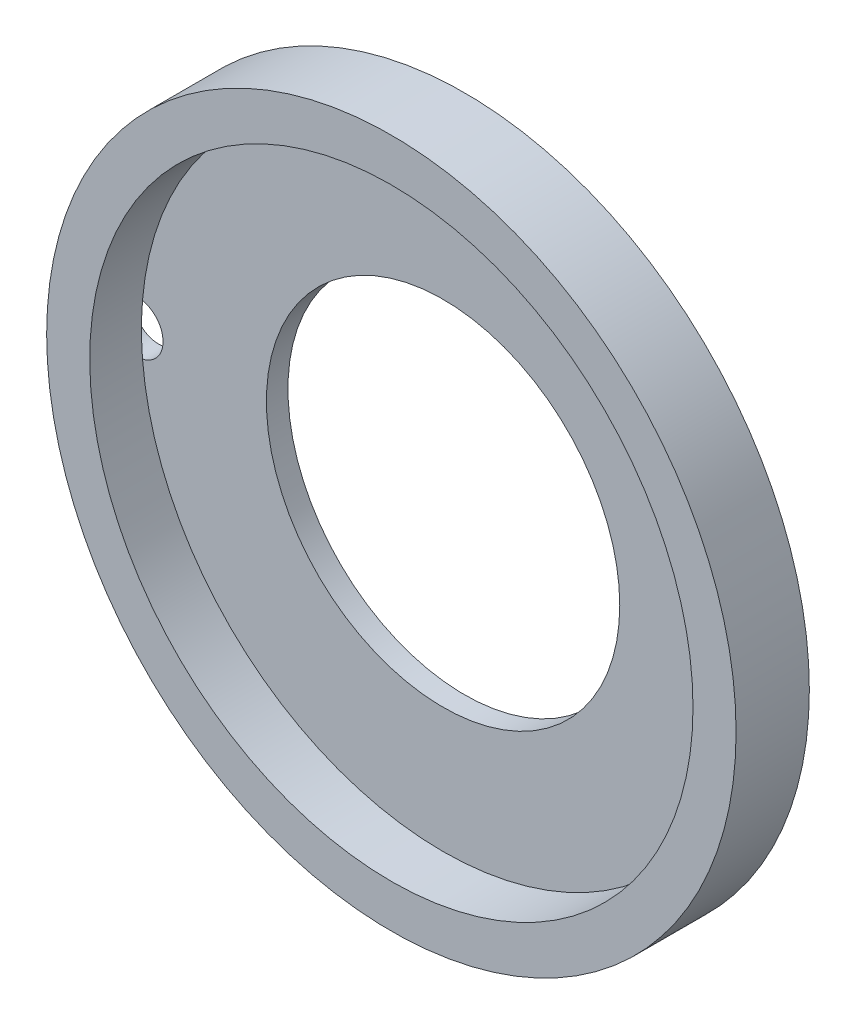
ISO-10303-21;
HEADER;
FILE_DESCRIPTION(('STEP AP214'),'2;1');
FILE_NAME('part.step','',(''),(''),'','','');
FILE_SCHEMA(('AUTOMOTIVE_DESIGN { 1 0 10303 214 1 1 1 1 }'));
ENDSEC;
DATA;
#1=APPLICATION_CONTEXT('core data for automotive mechanical design processes');
#2=APPLICATION_PROTOCOL_DEFINITION('international standard','automotive_design',2000,#1);
#3=PRODUCT_CONTEXT('',#1,'mechanical');
#4=PRODUCT('Part','Part','',(#3));
#5=PRODUCT_RELATED_PRODUCT_CATEGORY('part','',(#4));
#6=PRODUCT_DEFINITION_FORMATION('','',#4);
#7=PRODUCT_DEFINITION_CONTEXT('part definition',#1,'design');
#8=PRODUCT_DEFINITION('design','',#6,#7);
#9=PRODUCT_DEFINITION_SHAPE('','',#8);
#10=(LENGTH_UNIT() NAMED_UNIT(*) SI_UNIT(.MILLI.,.METRE.));
#11=(NAMED_UNIT(*) PLANE_ANGLE_UNIT() SI_UNIT($,.RADIAN.));
#12=(NAMED_UNIT(*) SI_UNIT($,.STERADIAN.) SOLID_ANGLE_UNIT());
#13=UNCERTAINTY_MEASURE_WITH_UNIT(LENGTH_MEASURE(1.E-05),#10,'distance_accuracy_value','');
#14=(GEOMETRIC_REPRESENTATION_CONTEXT(3) GLOBAL_UNCERTAINTY_ASSIGNED_CONTEXT((#13)) GLOBAL_UNIT_ASSIGNED_CONTEXT((#10,
#11,#12)) REPRESENTATION_CONTEXT('',''));
#15=CARTESIAN_POINT('',(0.,0.,0.));
#16=DIRECTION('',(0.,0.,1.));
#17=DIRECTION('',(1.,0.,0.));
#18=AXIS2_PLACEMENT_3D('',#15,#16,#17);
#19=CARTESIAN_POINT('',(0.,0.,-2.5));
#20=DIRECTION('',(0.,0.,1.));
#21=DIRECTION('',(1.,0.,0.));
#22=AXIS2_PLACEMENT_3D('',#19,#20,#21);
#23=PLANE('',#22);
#24=CARTESIAN_POINT('',(0.,0.,-2.5));
#25=DIRECTION('',(0.,0.,1.));
#26=DIRECTION('',(1.,0.,0.));
#27=AXIS2_PLACEMENT_3D('',#24,#25,#26);
#28=CIRCLE('',#27,4.1);
#29=CARTESIAN_POINT('',(4.1,0.,-2.5));
#30=VERTEX_POINT('',#29);
#31=EDGE_CURVE('E49',#30,#30,#28,.T.);
#32=ORIENTED_EDGE('',*,*,#31,.F.);
#33=EDGE_LOOP('',(#32));
#34=FACE_BOUND('',#33,.T.);
#35=CARTESIAN_POINT('',(0.,0.,-2.5));
#36=DIRECTION('',(0.,0.,1.));
#37=DIRECTION('',(1.,0.,0.));
#38=AXIS2_PLACEMENT_3D('',#35,#36,#37);
#39=CIRCLE('',#38,7.);
#40=CARTESIAN_POINT('',(6.97555052706432,0.58710731771052,-2.49992647224679));
#41=VERTEX_POINT('',#40);
#42=CARTESIAN_POINT('',(-6.97553915289986,0.587127160855668,-2.49992820798545));
#43=VERTEX_POINT('',#42);
#44=EDGE_CURVE('E94',#41,#43,#39,.T.);
#45=ORIENTED_EDGE('',*,*,#44,.T.);
#46=CARTESIAN_POINT('',(-6.97525376574585,0.588077281782455,-2.5));
#47=CARTESIAN_POINT('',(-6.96697990629048,0.586423698720654,-2.5));
#48=CARTESIAN_POINT('',(-6.9587416930814,0.584590165604334,-2.5));
#49=CARTESIAN_POINT('',(-6.94240715358778,0.580573892704627,-2.5));
#50=CARTESIAN_POINT('',(-6.93431025518007,0.578393478269612,-2.5));
#51=CARTESIAN_POINT('',(-6.91825824291663,0.573683541245611,-2.5));
#52=CARTESIAN_POINT('',(-6.91030265376792,0.571155640364122,-2.5));
#53=CARTESIAN_POINT('',(-6.89453316671084,0.565751610703839,-2.5));
#54=CARTESIAN_POINT('',(-6.8867189604973,0.562876381790841,-2.5));
#55=CARTESIAN_POINT('',(-6.87123205409678,0.556778384150788,-2.5));
#56=CARTESIAN_POINT('',(-6.86355928210395,0.553555797804259,-2.5));
#57=CARTESIAN_POINT('',(-6.8483549954878,0.546763817032701,-2.5));
#58=CARTESIAN_POINT('',(-6.84082371046806,0.543193908715248,-2.5));
#59=CARTESIAN_POINT('',(-6.82590208432513,0.535707974051064,-2.5));
#60=CARTESIAN_POINT('',(-6.8185123314664,0.531790775544382,-2.5));
#61=CARTESIAN_POINT('',(-6.80387340091427,0.523610910231177,-2.5));
#62=CARTESIAN_POINT('',(-6.79662521705714,0.519346465754322,-2.5));
#63=CARTESIAN_POINT('',(-6.78226901426695,0.510472699847726,-2.5));
#64=CARTESIAN_POINT('',(-6.77516242937389,0.505861059953131,-2.5));
#65=CARTESIAN_POINT('',(-6.7610889735976,0.496293423088125,-2.5));
#66=CARTESIAN_POINT('',(-6.75412399808875,0.49133464021393,-2.5));
#67=CARTESIAN_POINT('',(-6.74033332874348,0.481073170511377,-2.5));
#68=CARTESIAN_POINT('',(-6.73350999957698,0.475767308945436,-2.5));
#69=CARTESIAN_POINT('',(-6.72000204970976,0.46481201660374,-2.5));
#70=CARTESIAN_POINT('',(-6.71332025592354,0.459159101975096,-2.5));
#71=CARTESIAN_POINT('',(-6.70146473826201,0.448716323859663,-2.5));
#72=CARTESIAN_POINT('',(-6.69625043277862,0.443972404094271,-2.5));
#73=CARTESIAN_POINT('',(-6.68590933902217,0.434267387767563,-2.5));
#74=CARTESIAN_POINT('',(-6.68078436558348,0.429304361550329,-2.5));
#75=CARTESIAN_POINT('',(-6.6681471011488,0.416687476849063,-2.5));
#76=CARTESIAN_POINT('',(-6.66073122072199,0.408936291446989,-2.5));
#77=CARTESIAN_POINT('',(-6.64994448135581,0.397097704009619,-2.5));
#78=CARTESIAN_POINT('',(-6.64642712572301,0.393142884861783,-2.5));
#79=CARTESIAN_POINT('',(-6.63951831342334,0.385179817425009,-2.5));
#80=CARTESIAN_POINT('',(-6.63612607642166,0.381172246756721,-2.5));
#81=CARTESIAN_POINT('',(-6.62728947562965,0.370464300979716,-2.5));
#82=CARTESIAN_POINT('',(-6.62193111813585,0.363692582250393,-2.5));
#83=CARTESIAN_POINT('',(-6.61156301924985,0.350001174545457,-2.5));
#84=CARTESIAN_POINT('',(-6.60655015905835,0.34308384675734,-2.5));
#85=CARTESIAN_POINT('',(-6.59687256200322,0.329101509252138,-2.5));
#86=CARTESIAN_POINT('',(-6.59220509791002,0.322038389146193,-2.5));
#87=CARTESIAN_POINT('',(-6.5832179211868,0.307765001973483,-2.5));
#88=CARTESIAN_POINT('',(-6.57889594921282,0.300556158295564,-2.5));
#89=CARTESIAN_POINT('',(-6.57059925444704,0.285991783011548,-2.5));
#90=CARTESIAN_POINT('',(-6.56662281368143,0.278637230576297,-2.5));
#91=CARTESIAN_POINT('',(-6.5590166220593,0.263781888224626,-2.5));
#92=CARTESIAN_POINT('',(-6.55538575877183,0.256281668081852,-2.5));
#93=CARTESIAN_POINT('',(-6.54847009807038,0.241135397058149,-2.5));
#94=CARTESIAN_POINT('',(-6.54518484597083,0.233489553813549,-2.5));
#95=CARTESIAN_POINT('',(-6.53895973664767,0.218052393178284,-2.5));
#96=CARTESIAN_POINT('',(-6.53602011985273,0.210260978841649,-2.5));
#97=CARTESIAN_POINT('',(-6.53048557770596,0.194532971117786,-2.5));
#98=CARTESIAN_POINT('',(-6.52789160852972,0.18659604138126,-2.5));
#99=CARTESIAN_POINT('',(-6.52304764297845,0.170577229830558,-2.5));
#100=CARTESIAN_POINT('',(-6.52079932149375,0.162494841893252,-2.5));
#101=CARTESIAN_POINT('',(-6.51664593677974,0.146185269585434,-2.5));
#102=CARTESIAN_POINT('',(-6.5147432526184,0.137957480045045,-2.5));
#103=CARTESIAN_POINT('',(-6.51128044374281,0.121357187037543,-2.5));
#104=CARTESIAN_POINT('',(-6.50972337136237,0.112984047920259,-2.5));
#105=CARTESIAN_POINT('',(-6.50695402464407,0.0961106479654506,-2.5));
#106=CARTESIAN_POINT('',(-6.50574467927245,0.0876099076555871,-2.5));
#107=CARTESIAN_POINT('',(-6.50366584674941,0.0704642776854486,-2.5));
#108=CARTESIAN_POINT('',(-6.50280058371131,0.0618188777905461,-2.5));
#109=CARTESIAN_POINT('',(-6.50140956081519,0.0443838096479167,-2.5));
#110=CARTESIAN_POINT('',(-6.50088852980371,0.0355937664280112,-2.5));
#111=CARTESIAN_POINT('',(-6.50018477101704,0.0178693367006783,-2.5));
#112=CARTESIAN_POINT('',(-6.50000719390881,0.00893474905512071,-2.5));
#113=CARTESIAN_POINT('',(-6.49999280588945,-0.00893499961107578,-2.5));
#114=CARTESIAN_POINT('',(-6.50015600453452,-0.0178701606407676,-2.5));
#115=CARTESIAN_POINT('',(-6.50083671255215,-0.0355986876388286,-2.5));
#116=CARTESIAN_POINT('',(-6.50134909868004,-0.0443922467277292,-2.5));
#117=CARTESIAN_POINT('',(-6.50272703371341,-0.061837311356122,-2.5));
#118=CARTESIAN_POINT('',(-6.50358792685108,-0.0704891826326886,-2.5));
#119=CARTESIAN_POINT('',(-6.50566258452377,-0.0876507205251129,-2.5));
#120=CARTESIAN_POINT('',(-6.50687221870573,-0.096160884505827,-2.5));
#121=CARTESIAN_POINT('',(-6.5096409303574,-0.113021694659241,-2.5));
#122=CARTESIAN_POINT('',(-6.5111957373013,-0.121373040492432,-2.5));
#123=CARTESIAN_POINT('',(-6.51465556209771,-0.137933911182517,-2.5));
#124=CARTESIAN_POINT('',(-6.51655770599623,-0.146144035481344,-2.5));
#125=CARTESIAN_POINT('',(-6.52071153674422,-0.162422448602463,-2.5));
#126=CARTESIAN_POINT('',(-6.52296103375498,-0.170491295641594,-2.5));
#127=CARTESIAN_POINT('',(-6.52780886911464,-0.186487208399263,-2.5));
#128=CARTESIAN_POINT('',(-6.53040572898317,-0.194414721921646,-2.5));
#129=CARTESIAN_POINT('',(-6.5359475648934,-0.210128091428767,-2.5));
#130=CARTESIAN_POINT('',(-6.53889178434853,-0.217914214173441,-2.5));
#131=CARTESIAN_POINT('',(-6.54512760983372,-0.23334499702208,-2.5));
#132=CARTESIAN_POINT('',(-6.54841917401202,-0.240989674038765,-2.5));
#133=CARTESIAN_POINT('',(-6.55534897225863,-0.256137828131516,-2.5));
#134=CARTESIAN_POINT('',(-6.55898785447835,-0.26364100863677,-2.5));
#135=CARTESIAN_POINT('',(-6.56661160412305,-0.278506495564392,-2.5));
#136=CARTESIAN_POINT('',(-6.57059776858321,-0.285868136544796,-2.5));
#137=CARTESIAN_POINT('',(-6.57891544096119,-0.300450919126621,-2.5));
#138=CARTESIAN_POINT('',(-6.58324883941027,-0.307670981793034,-2.5));
#139=CARTESIAN_POINT('',(-6.59226041364947,-0.321971039449853,-2.5));
#140=CARTESIAN_POINT('',(-6.59694100686203,-0.329049510107056,-2.5));
#141=CARTESIAN_POINT('',(-6.6066464183738,-0.343066785479498,-2.5));
#142=CARTESIAN_POINT('',(-6.61167410580519,-0.350003601450974,-2.5));
#143=CARTESIAN_POINT('',(-6.62207344701293,-0.363738205159187,-2.5));
#144=CARTESIAN_POINT('',(-6.62744834481601,-0.370533537151725,-2.5));
#145=CARTESIAN_POINT('',(-6.63628884564292,-0.38125380601153,-2.5));
#146=CARTESIAN_POINT('',(-6.63966812494388,-0.385250300540975,-2.5));
#147=CARTESIAN_POINT('',(-6.64655000692628,-0.393193340714595,-2.5));
#148=CARTESIAN_POINT('',(-6.65005339556246,-0.397139204770393,-2.5));
#149=CARTESIAN_POINT('',(-6.66079675533325,-0.408955508173855,-2.5));
#150=CARTESIAN_POINT('',(-6.66818036836743,-0.416696236722928,-2.5));
#151=CARTESIAN_POINT('',(-6.68080725792648,-0.429343630402293,-2.5));
#152=CARTESIAN_POINT('',(-6.68595605061419,-0.434345299552442,-2.5));
#153=CARTESIAN_POINT('',(-6.6963499566765,-0.444123489959172,-2.5));
#154=CARTESIAN_POINT('',(-6.70159322645265,-0.44890196664328,-2.5));
#155=CARTESIAN_POINT('',(-6.71345207899294,-0.45935987176221,-2.5));
#156=CARTESIAN_POINT('',(-6.72010688585597,-0.464994938393768,-2.5));
#157=CARTESIAN_POINT('',(-6.73356497257245,-0.475916288227512,-2.5));
#158=CARTESIAN_POINT('',(-6.74036551367174,-0.481205944539995,-2.5));
#159=CARTESIAN_POINT('',(-6.75411463132824,-0.491436848928233,-2.5));
#160=CARTESIAN_POINT('',(-6.76106093902598,-0.496381143163864,-2.5));
#161=CARTESIAN_POINT('',(-6.77510109783111,-0.505921645178492,-2.5));
#162=CARTESIAN_POINT('',(-6.78219315325781,-0.510520493656939,-2.5));
#163=CARTESIAN_POINT('',(-6.79652432699218,-0.519370540937119,-2.5));
#164=CARTESIAN_POINT('',(-6.80376211221575,-0.523623897094491,-2.5));
#165=CARTESIAN_POINT('',(-6.81838427643744,-0.531783463941841,-2.5));
#166=CARTESIAN_POINT('',(-6.82576776077442,-0.535691277131879,-2.5));
#167=CARTESIAN_POINT('',(-6.8406808831274,-0.543160332992319,-2.5));
#168=CARTESIAN_POINT('',(-6.84821002740799,-0.546722561184334,-2.5));
#169=CARTESIAN_POINT('',(-6.86341407161552,-0.553501083782543,-2.5));
#170=CARTESIAN_POINT('',(-6.87108882926005,-0.55671769728854,-2.5));
#171=CARTESIAN_POINT('',(-6.88658375379996,-0.562805658448182,-2.5));
#172=CARTESIAN_POINT('',(-6.89440407056043,-0.56567662460574,-2.5));
#173=CARTESIAN_POINT('',(-6.91018983693852,-0.571074040039368,-2.5));
#174=CARTESIAN_POINT('',(-6.9181556622598,-0.573599390177141,-2.5));
#175=CARTESIAN_POINT('',(-6.93423221152132,-0.578306138510899,-2.5));
#176=CARTESIAN_POINT('',(-6.94234346677413,-0.580485719648844,-2.5));
#177=CARTESIAN_POINT('',(-6.95871081487132,-0.584502223100507,-2.5));
#178=CARTESIAN_POINT('',(-6.96696752471849,-0.586336632914743,-2.5));
#179=CARTESIAN_POINT('',(-6.9752596977618,-0.587991624914976,-2.5));
#180=B_SPLINE_CURVE_WITH_KNOTS('',3,(#46,#47,#48,#49,#50,#51,#52,#53,#54,#55,#56,#57,#58,#59,
#60,#61,#62,#63,#64,#65,#66,#67,#68,#69,#70,#71,#72,#73,#74,#75,#76,#77,#78,#79,#80,#81,#82,#83,
#84,#85,#86,#87,#88,#89,#90,#91,#92,#93,#94,#95,#96,#97,#98,#99,#100,#101,#102,#103,#104,#105,
#106,#107,#108,#109,#110,#111,#112,#113,#114,#115,#116,#117,#118,#119,#120,#121,#122,#123,#124,
#125,#126,#127,#128,#129,#130,#131,#132,#133,#134,#135,#136,#137,#138,#139,#140,#141,#142,#143,
#144,#145,#146,#147,#148,#149,#150,#151,#152,#153,#154,#155,#156,#157,#158,#159,#160,#161,#162,
#163,#164,#165,#166,#167,#168,#169,#170,#171,#172,#173,#174,#175,#176,#177,#178,#179),
.UNSPECIFIED.,.F.,.F.,(4,2,2,2,2,2,2,2,2,2,2,2,2,2,2,2,2,2,2,2,2,2,2,2,2,2,2,2,2,2,2,2,2,2,2,2,
2,2,2,2,2,2,2,2,2,2,2,2,2,2,2,2,2,2,2,2,2,2,2,2,2,2,2,2,2,2,4),(0.,0.0253109121493602,
0.0504587939035583,0.0754930623329075,0.100463809038629,0.125421508100619,0.150416712642199,
0.175499749018622,0.200720417800903,0.226127710257383,0.251769547989723,0.277692551881889,
0.303941844738532,0.325086514897414,0.346486287859628,0.378654527065373,0.394531222917508,
0.410281302899537,0.436179143899964,0.46179964710699,0.487189549762534,0.512396871820099,
0.537470682259454,0.562460836535936,0.587417691461091,0.612391805277741,0.637433631694315,
0.662593217060684,0.687919909650053,0.713462089185171,0.739213502482546,0.765271954471622,
0.79168132364166,0.818483765069434,0.845286958114437,0.871705131168323,0.897781449768808,
0.923560796737931,0.949037402706664,0.974312046635058,0.999433407185536,1.02445105780038,
1.04941518976695,1.07437631721707,1.09938497248874,1.12449140094028,1.14974526434505,
1.17519536140419,1.20088937276777,1.22687363638563,1.2425732864604,1.25840211954234,
1.29048122613164,1.3120128617611,1.33329140406249,1.35944424688467,1.385283358613,
1.41085430224669,1.4362040868198,1.46138096020925,1.48643416929736,1.511413692386,
1.53636995047968,1.56135350544129,1.58641475391737,1.6116036262228,1.63696929903149),.UNSPECIFIED.);
#181=CARTESIAN_POINT('',(-6.9755636245741,-0.587105452720418,-2.49992560583814));
#182=VERTEX_POINT('',#181);
#183=EDGE_CURVE('E92',#43,#182,#180,.T.);
#184=ORIENTED_EDGE('',*,*,#183,.T.);
#185=CARTESIAN_POINT('',(6.97555195205322,-0.58712496469415,-2.49992735280683));
#186=VERTEX_POINT('',#185);
#187=EDGE_CURVE('E91',#182,#186,#39,.T.);
#188=ORIENTED_EDGE('',*,*,#187,.T.);
#189=CARTESIAN_POINT('',(6.9752537666858,-0.58807728197037,-2.5));
#190=CARTESIAN_POINT('',(6.96697990722233,-0.58642369892106,-2.5));
#191=CARTESIAN_POINT('',(6.95874169400488,-0.58459016581709,-2.5));
#192=CARTESIAN_POINT('',(6.94240715449464,-0.580573892941798,-2.5));
#193=CARTESIAN_POINT('',(6.93431025607866,-0.578393478518874,-2.5));
#194=CARTESIAN_POINT('',(6.91825824379877,-0.573683541518806,-2.5));
#195=CARTESIAN_POINT('',(6.91030265464187,-0.571155640649188,-2.5));
#196=CARTESIAN_POINT('',(6.89453316756866,-0.565751611012212,-2.5));
#197=CARTESIAN_POINT('',(6.88671896134717,-0.562876382110679,-2.5));
#198=CARTESIAN_POINT('',(6.87123205493034,-0.556778384493816,-2.5));
#199=CARTESIAN_POINT('',(6.86355928292912,-0.553555798159037,-2.5));
#200=CARTESIAN_POINT('',(6.84835499629834,-0.546763817408662,-2.5));
#201=CARTESIAN_POINT('',(6.84082371127232,-0.543193909100661,-2.5));
#202=CARTESIAN_POINT('',(6.82590208510948,-0.535707974462718,-2.5));
#203=CARTESIAN_POINT('',(6.81851233223707,-0.531790775972872,-2.5));
#204=CARTESIAN_POINT('',(6.80387340168579,-0.523610910664463,-2.5));
#205=CARTESIAN_POINT('',(6.79662521784332,-0.519346466175428,-2.5));
#206=CARTESIAN_POINT('',(6.78226901497686,-0.510472700351879,-2.5));
#207=CARTESIAN_POINT('',(6.77516242999206,-0.505861060553323,-2.5));
#208=CARTESIAN_POINT('',(6.7610889744316,-0.496293423473533,-2.5));
#209=CARTESIAN_POINT('',(6.75412399923399,-0.491334640284765,-2.5));
#210=CARTESIAN_POINT('',(6.740333329,-0.481073171492169,-2.5));
#211=CARTESIAN_POINT('',(6.73350999861688,-0.475767311167685,-2.5));
#212=CARTESIAN_POINT('',(6.72000205205319,-0.464812015465666,-2.5));
#213=CARTESIAN_POINT('',(6.71332026285948,-0.459159096161507,-2.5));
#214=CARTESIAN_POINT('',(6.7014647337567,-0.448716329495616,-2.5));
#215=CARTESIAN_POINT('',(6.6962504160589,-0.443972421964896,-2.5));
#216=CARTESIAN_POINT('',(6.68590935659465,-0.434267370292358,-2.5));
#217=CARTESIAN_POINT('',(6.68078443037284,-0.429304295771168,-2.5));
#218=CARTESIAN_POINT('',(6.66813811898387,-0.416678705513152,-2.5));
#219=CARTESIAN_POINT('',(6.66071340790758,-0.408918598112365,-2.5));
#220=CARTESIAN_POINT('',(6.64991384783868,-0.397067119696294,-2.5));
#221=CARTESIAN_POINT('',(6.64639250537537,-0.393108340695573,-2.5));
#222=CARTESIAN_POINT('',(6.63947604634277,-0.385137649605567,-2.5));
#223=CARTESIAN_POINT('',(6.63608014177133,-0.381126421903321,-2.5));
#224=CARTESIAN_POINT('',(6.62723445903703,-0.370409455927015,-2.5));
#225=CARTESIAN_POINT('',(6.62187068232193,-0.363632364674144,-2.5));
#226=CARTESIAN_POINT('',(6.61149264228157,-0.349931035201485,-2.5));
#227=CARTESIAN_POINT('',(6.60647521975217,-0.343009189350331,-2.5));
#228=CARTESIAN_POINT('',(6.59678939729563,-0.329018640694985,-2.5));
#229=CARTESIAN_POINT('',(6.59211822677497,-0.321951858072026,-2.5));
#230=CARTESIAN_POINT('',(6.58312453962799,-0.30767197126932,-2.5));
#231=CARTESIAN_POINT('',(6.57879971789689,-0.30046031971722,-2.5));
#232=CARTESIAN_POINT('',(6.57049822811152,-0.285891155784646,-2.5));
#233=CARTESIAN_POINT('',(6.56651979472473,-0.278534649831702,-2.5));
#234=CARTESIAN_POINT('',(6.55891052368076,-0.263676229748867,-2.5));
#235=CARTESIAN_POINT('',(6.55527852557333,-0.25617491011365,-2.5));
#236=CARTESIAN_POINT('',(6.54836150135936,-0.24102727218821,-2.5));
#237=CARTESIAN_POINT('',(6.54507597293182,-0.233381183315486,-2.5));
#238=CARTESIAN_POINT('',(6.53885121633435,-0.217944366645291,-2.5));
#239=CARTESIAN_POINT('',(6.53591218242765,-0.210153560518188,-2.5));
#240=CARTESIAN_POINT('',(6.53037970954723,-0.194427607753604,-2.5));
#241=CARTESIAN_POINT('',(6.52778718311392,-0.186492140189023,-2.5));
#242=CARTESIAN_POINT('',(6.52294700379321,-0.170477094811294,-2.5));
#243=CARTESIAN_POINT('',(6.5207009856588,-0.162397023266046,-2.5));
#244=CARTESIAN_POINT('',(6.51655310400578,-0.146092928649371,-2.5));
#245=CARTESIAN_POINT('',(6.51465358372561,-0.137868310101951,-2.5));
#246=CARTESIAN_POINT('',(6.5111979965183,-0.121275206640935,-2.5));
#247=CARTESIAN_POINT('',(6.50964495104156,-0.112906093542708,-2.5));
#248=CARTESIAN_POINT('',(6.50688452934292,-0.0960415846139106,-2.5));
#249=CARTESIAN_POINT('',(6.50568005511964,-0.0875457149952916,-2.5));
#250=CARTESIAN_POINT('',(6.50361186686187,-0.0704106739971589,-2.5));
#251=CARTESIAN_POINT('',(6.50275235725887,-0.0617709970771812,-2.5));
#252=CARTESIAN_POINT('',(6.50137362268307,-0.0443482246021878,-2.5));
#253=CARTESIAN_POINT('',(6.5008591107541,-0.0355647583102075,-2.5));
#254=CARTESIAN_POINT('',(6.50016960432915,-0.0178543280667493,-2.5));
#255=CARTESIAN_POINT('',(6.49999975629653,-0.0089271672105942,-2.5));
#256=CARTESIAN_POINT('',(6.50000024412492,0.008942605560086,-2.5));
#257=CARTESIAN_POINT('',(6.50017116879675,0.0178852174966084,-2.5));
#258=CARTESIAN_POINT('',(6.50086612054851,0.0356277847776313,-2.5));
#259=CARTESIAN_POINT('',(6.50138501954132,0.0444279374752159,-2.5));
#260=CARTESIAN_POINT('',(6.50277522749682,0.0618853250020768,-2.5));
#261=CARTESIAN_POINT('',(6.50364186430785,0.0705429298029494,-2.5));
#262=CARTESIAN_POINT('',(6.50572714395241,0.0877150712587582,-2.5));
#263=CARTESIAN_POINT('',(6.50694163601075,0.096230110014929,-2.5));
#264=CARTESIAN_POINT('',(6.50971922587653,0.113099798058831,-2.5));
#265=CARTESIAN_POINT('',(6.51127802835951,0.121455152936426,-2.5));
#266=CARTESIAN_POINT('',(6.51474501620827,0.138023179805068,-2.5));
#267=CARTESIAN_POINT('',(6.51665029627778,0.146236458761585,-2.5));
#268=CARTESIAN_POINT('',(6.52080957872186,0.162520317472573,-2.5));
#269=CARTESIAN_POINT('',(6.52306135503294,0.170591465223114,-2.5));
#270=CARTESIAN_POINT('',(6.52791293250478,0.186591113324736,-2.5));
#271=CARTESIAN_POINT('',(6.53051121473891,0.194520073970363,-2.5));
#272=CARTESIAN_POINT('',(6.53605508305687,0.210235468883103,-2.5));
#273=CARTESIAN_POINT('',(6.53899986871587,0.218022185429247,-2.5));
#274=CARTESIAN_POINT('',(6.54523601729569,0.233453283897738,-2.5));
#275=CARTESIAN_POINT('',(6.54852729211336,0.241097701424013,-2.5));
#276=CARTESIAN_POINT('',(6.55545570456418,0.256244461683478,-2.5));
#277=CARTESIAN_POINT('',(6.5590934427471,0.263746529661032,-2.5));
#278=CARTESIAN_POINT('',(6.5667140975742,0.27860891251997,-2.5));
#279=CARTESIAN_POINT('',(6.57069826337864,0.285968586652956,-2.5));
#280=CARTESIAN_POINT('',(6.57901113393438,0.300546557869891,-2.5));
#281=CARTESIAN_POINT('',(6.58334168211293,0.307763803200642,-2.5));
#282=CARTESIAN_POINT('',(6.5923467412709,0.32205733070077,-2.5));
#283=CARTESIAN_POINT('',(6.59702362417966,0.329132117513143,-2.5));
#284=CARTESIAN_POINT('',(6.60672083207539,0.343141186505468,-2.5));
#285=CARTESIAN_POINT('',(6.61174398345341,0.350073510710504,-2.5));
#286=CARTESIAN_POINT('',(6.62213333975889,0.363798069593847,-2.5));
#287=CARTESIAN_POINT('',(6.62750274759455,0.370587877428966,-2.5));
#288=CARTESIAN_POINT('',(6.63858409941192,0.384028044081207,-2.5));
#289=CARTESIAN_POINT('',(6.64429954055653,0.390675517061052,-2.5));
#290=CARTESIAN_POINT('',(6.65607331779345,0.403830794840097,-2.5));
#291=CARTESIAN_POINT('',(6.66213537829681,0.410335261800284,-2.5));
#292=CARTESIAN_POINT('',(6.67455177767361,0.423157930785266,-2.5));
#293=CARTESIAN_POINT('',(6.68090803310329,0.429474276048558,-2.5));
#294=CARTESIAN_POINT('',(6.69377638150263,0.441767694821891,-2.5));
#295=CARTESIAN_POINT('',(6.70028517827729,0.447748214743037,-2.5));
#296=CARTESIAN_POINT('',(6.71345202195694,0.459360048561346,-2.5));
#297=CARTESIAN_POINT('',(6.72010687039799,0.464994985263816,-2.5));
#298=CARTESIAN_POINT('',(6.73356498712271,0.47591624133359,-2.5));
#299=CARTESIAN_POINT('',(6.74036551728377,0.481205931837418,-2.5));
#300=CARTESIAN_POINT('',(6.75411462703046,0.491436860960819,-2.5));
#301=CARTESIAN_POINT('',(6.76106093761284,0.496381146189585,-2.5));
#302=CARTESIAN_POINT('',(6.77510109850846,0.505921641687269,-2.5));
#303=CARTESIAN_POINT('',(6.78219315317261,0.510520492556886,-2.5));
#304=CARTESIAN_POINT('',(6.7965243263535,0.519370541583009,-2.5));
#305=CARTESIAN_POINT('',(6.80376211177956,0.523623897115764,-2.5));
#306=CARTESIAN_POINT('',(6.81838427614908,0.531783463517557,-2.5));
#307=CARTESIAN_POINT('',(6.82576776043266,0.535691276882732,-2.5));
#308=CARTESIAN_POINT('',(6.84068088274727,0.543160332879696,-2.5));
#309=CARTESIAN_POINT('',(6.84821002704268,0.546722561033736,-2.5));
#310=CARTESIAN_POINT('',(6.86341407126178,0.55350108361258,-2.5));
#311=CARTESIAN_POINT('',(6.87108882890307,0.556717697137146,-2.5));
#312=CARTESIAN_POINT('',(6.88658375344146,0.562805658318476,-2.5));
#313=CARTESIAN_POINT('',(6.89440407020365,0.565676624479146,-2.5));
#314=CARTESIAN_POINT('',(6.91018983658401,0.571074039922781,-2.5));
#315=CARTESIAN_POINT('',(6.91815566190583,0.57359939006747,-2.5));
#316=CARTESIAN_POINT('',(6.93423221116886,0.578306138413779,-2.5));
#317=CARTESIAN_POINT('',(6.94234346642264,0.580485719557363,-2.5));
#318=CARTESIAN_POINT('',(6.95871081452189,0.584502223020036,-2.5));
#319=CARTESIAN_POINT('',(6.96696752437014,0.58633663283965,-2.5));
#320=CARTESIAN_POINT('',(6.97525969741451,0.587991624845642,-2.5));
#321=B_SPLINE_CURVE_WITH_KNOTS('',3,(#189,#190,#191,#192,#193,#194,#195,#196,#197,#198,#199,
#200,#201,#202,#203,#204,#205,#206,#207,#208,#209,#210,#211,#212,#213,#214,#215,#216,#217,#218,
#219,#220,#221,#222,#223,#224,#225,#226,#227,#228,#229,#230,#231,#232,#233,#234,#235,#236,#237,
#238,#239,#240,#241,#242,#243,#244,#245,#246,#247,#248,#249,#250,#251,#252,#253,#254,#255,#256,
#257,#258,#259,#260,#261,#262,#263,#264,#265,#266,#267,#268,#269,#270,#271,#272,#273,#274,#275,
#276,#277,#278,#279,#280,#281,#282,#283,#284,#285,#286,#287,#288,#289,#290,#291,#292,#293,#294,
#295,#296,#297,#298,#299,#300,#301,#302,#303,#304,#305,#306,#307,#308,#309,#310,#311,#312,#313,
#314,#315,#316,#317,#318,#319,#320),.UNSPECIFIED.,.F.,.F.,(4,2,2,2,2,2,2,2,2,2,2,2,2,2,2,2,2,2,
2,2,2,2,2,2,2,2,2,2,2,2,2,2,2,2,2,2,2,2,2,2,2,2,2,2,2,2,2,2,2,2,2,2,2,2,2,2,2,2,2,2,2,2,2,2,2,
4),(0.,0.0253109121658184,0.0504587939345242,0.075493062376453,0.100463809092865,
0.125421508163703,0.150416712712346,0.17549974909412,0.200720417880118,0.226127710338768,
0.251769548071826,0.277692551963358,0.303941844818119,0.325086515411298,0.346486288818038,
0.378692189812931,0.394585712986456,0.410351276041263,0.436271846683015,0.461911354667856,
0.487316549395413,0.512535483368024,0.537617279643698,0.562611869863254,0.587569709076659,
0.612541475099318,0.637577761175898,0.662728771192511,0.688044026500977,0.713572092623179,
0.739306948633207,0.765346573696715,0.791735050627799,0.818514739530768,0.845340740347339,
0.871779849620901,0.897875024445217,0.923670940199602,0.949161597871441,0.974447617390619,
0.999577492088575,1.02460062311119,1.04956704525462,1.07452713435187,1.09953130451347,
1.12462970421996,1.14987192034322,1.17530669862864,1.20098168806726,1.22694321505523,
1.25323609144885,1.27990345875765,1.30677958761918,1.3332901069941,1.35944294983211,
1.38528206157526,1.41085300522272,1.43620278980864,1.46137966320994,1.48643287230899,
1.5114123954077,1.53636865351064,1.56135220848074,1.58641345696463,1.61160232927723,
1.63696800209253),.UNSPECIFIED.);
#322=EDGE_CURVE('E69',#186,#41,#321,.T.);
#323=ORIENTED_EDGE('',*,*,#322,.T.);
#324=EDGE_LOOP('',(#45,#184,#188,#323));
#325=FACE_BOUND('',#324,.T.);
#326=ADVANCED_FACE('F39',(#34,#325),#23,.T.);
#327=CARTESIAN_POINT('',(0.,0.,-3.));
#328=DIRECTION('',(0.,0.,1.));
#329=DIRECTION('',(1.,0.,0.));
#330=AXIS2_PLACEMENT_3D('',#327,#328,#329);
#331=PLANE('',#330);
#332=CARTESIAN_POINT('',(-7.1,0.,-3.));
#333=DIRECTION('',(0.,0.,-1.));
#334=DIRECTION('',(-1.,0.,0.));
#335=AXIS2_PLACEMENT_3D('',#332,#333,#334);
#336=CIRCLE('',#335,0.6);
#337=CARTESIAN_POINT('',(-7.7,0.,-3.));
#338=VERTEX_POINT('',#337);
#339=EDGE_CURVE('E153',#338,#338,#336,.T.);
#340=ORIENTED_EDGE('',*,*,#339,.F.);
#341=EDGE_LOOP('',(#340));
#342=FACE_BOUND('',#341,.T.);
#343=CARTESIAN_POINT('',(7.1,0.,-3.));
#344=DIRECTION('',(0.,0.,-1.));
#345=DIRECTION('',(-1.,0.,0.));
#346=AXIS2_PLACEMENT_3D('',#343,#344,#345);
#347=CIRCLE('',#346,0.6);
#348=CARTESIAN_POINT('',(6.5,0.,-3.));
#349=VERTEX_POINT('',#348);
#350=EDGE_CURVE('E88',#349,#349,#347,.T.);
#351=ORIENTED_EDGE('',*,*,#350,.F.);
#352=EDGE_LOOP('',(#351));
#353=FACE_BOUND('',#352,.T.);
#354=CARTESIAN_POINT('',(0.,0.,-3.));
#355=DIRECTION('',(0.,0.,1.));
#356=DIRECTION('',(1.,0.,0.));
#357=AXIS2_PLACEMENT_3D('',#354,#355,#356);
#358=CIRCLE('',#357,8.);
#359=CARTESIAN_POINT('',(8.,0.,-3.));
#360=VERTEX_POINT('',#359);
#361=EDGE_CURVE('E11',#360,#360,#358,.T.);
#362=ORIENTED_EDGE('',*,*,#361,.F.);
#363=EDGE_LOOP('',(#362));
#364=FACE_BOUND('',#363,.T.);
#365=CARTESIAN_POINT('',(0.,0.,-3.));
#366=DIRECTION('',(0.,0.,1.));
#367=DIRECTION('',(1.,0.,0.));
#368=AXIS2_PLACEMENT_3D('',#365,#366,#367);
#369=CIRCLE('',#368,4.1);
#370=CARTESIAN_POINT('',(4.1,0.,-3.));
#371=VERTEX_POINT('',#370);
#372=EDGE_CURVE('E161',#371,#371,#369,.T.);
#373=ORIENTED_EDGE('',*,*,#372,.T.);
#374=EDGE_LOOP('',(#373));
#375=FACE_BOUND('',#374,.T.);
#376=ADVANCED_FACE('F139',(#342,#353,#364,#375),#331,.F.);
#377=CARTESIAN_POINT('',(0.,0.,-2.5));
#378=DIRECTION('',(0.,0.,-1.));
#379=DIRECTION('',(-1.,0.,0.));
#380=AXIS2_PLACEMENT_3D('',#377,#378,#379);
#381=CYLINDRICAL_SURFACE('',#380,8.);
#382=ORIENTED_EDGE('',*,*,#361,.T.);
#383=EDGE_LOOP('',(#382));
#384=FACE_BOUND('',#383,.T.);
#385=CARTESIAN_POINT('',(0.,0.,-1.3));
#386=DIRECTION('',(0.,0.,1.));
#387=DIRECTION('',(1.,0.,0.));
#388=AXIS2_PLACEMENT_3D('',#385,#386,#387);
#389=CIRCLE('',#388,8.);
#390=CARTESIAN_POINT('',(8.,0.,-1.3));
#391=VERTEX_POINT('',#390);
#392=EDGE_CURVE('E162',#391,#391,#389,.T.);
#393=ORIENTED_EDGE('',*,*,#392,.F.);
#394=EDGE_LOOP('',(#393));
#395=FACE_BOUND('',#394,.T.);
#396=ADVANCED_FACE('F41',(#384,#395),#381,.T.);
#397=CARTESIAN_POINT('',(0.,0.,-2.5));
#398=DIRECTION('',(0.,0.,-1.));
#399=DIRECTION('',(-1.,0.,0.));
#400=AXIS2_PLACEMENT_3D('',#397,#398,#399);
#401=CYLINDRICAL_SURFACE('',#400,4.1);
#402=ORIENTED_EDGE('',*,*,#31,.T.);
#403=EDGE_LOOP('',(#402));
#404=FACE_BOUND('',#403,.T.);
#405=ORIENTED_EDGE('',*,*,#372,.F.);
#406=EDGE_LOOP('',(#405));
#407=FACE_BOUND('',#406,.T.);
#408=ADVANCED_FACE('F142',(#404,#407),#401,.F.);
#409=CARTESIAN_POINT('',(0.,0.,-1.3));
#410=DIRECTION('',(0.,0.,1.));
#411=DIRECTION('',(1.,0.,0.));
#412=AXIS2_PLACEMENT_3D('',#409,#410,#411);
#413=PLANE('',#412);
#414=ORIENTED_EDGE('',*,*,#392,.T.);
#415=EDGE_LOOP('',(#414));
#416=FACE_BOUND('',#415,.T.);
#417=CARTESIAN_POINT('',(0.,0.,-1.3));
#418=DIRECTION('',(0.,0.,1.));
#419=DIRECTION('',(1.,0.,0.));
#420=AXIS2_PLACEMENT_3D('',#417,#418,#419);
#421=CIRCLE('',#420,7.);
#422=CARTESIAN_POINT('',(7.,0.,-1.3));
#423=VERTEX_POINT('',#422);
#424=EDGE_CURVE('E169',#423,#423,#421,.T.);
#425=ORIENTED_EDGE('',*,*,#424,.F.);
#426=EDGE_LOOP('',(#425));
#427=FACE_BOUND('',#426,.T.);
#428=ADVANCED_FACE('F119',(#416,#427),#413,.T.);
#429=CARTESIAN_POINT('',(0.,0.,-1.3));
#430=DIRECTION('',(0.,0.,-1.));
#431=DIRECTION('',(-1.,0.,0.));
#432=AXIS2_PLACEMENT_3D('',#429,#430,#431);
#433=CYLINDRICAL_SURFACE('',#432,7.);
#434=ORIENTED_EDGE('',*,*,#424,.T.);
#435=EDGE_LOOP('',(#434));
#436=FACE_BOUND('',#435,.T.);
#437=ORIENTED_EDGE('',*,*,#44,.F.);
#438=CARTESIAN_POINT('',(6.97594168940768,-0.587034526729838,-2.4999));
#439=CARTESIAN_POINT('',(6.97995743167312,-0.538446339661556,-2.4999));
#440=CARTESIAN_POINT('',(6.98346511307634,-0.489816367791516,-2.4999));
#441=CARTESIAN_POINT('',(6.98948059120502,-0.392356086673966,-2.4999));
#442=CARTESIAN_POINT('',(6.9919855228472,-0.343525600484241,-2.4999));
#443=CARTESIAN_POINT('',(6.99599555171851,-0.245664348420081,-2.4999));
#444=CARTESIAN_POINT('',(6.99749736560949,-0.196633448266269,-2.4999));
#445=CARTESIAN_POINT('',(6.99950117763379,-0.0984017411379382,-2.4999));
#446=CARTESIAN_POINT('',(7.00000011319119,-0.0492008719509761,-2.4999));
#447=CARTESIAN_POINT('',(6.99999988671151,0.0492431633013652,-2.4999));
#448=CARTESIAN_POINT('',(6.99949986637596,0.0984863293714981,-2.4999));
#449=CARTESIAN_POINT('',(6.99749246057545,0.196743811581719,-2.4999));
#450=CARTESIAN_POINT('',(6.9959893454054,0.245758214618031,-2.4999));
#451=CARTESIAN_POINT('',(6.99197680798352,0.343588528529155,-2.4999));
#452=CARTESIAN_POINT('',(6.98947062656126,0.392404572074205,-2.4999));
#453=CARTESIAN_POINT('',(6.98345269206903,0.489838025028262,-2.4999));
#454=CARTESIAN_POINT('',(6.97994376115639,0.538455608846658,-2.4999));
#455=CARTESIAN_POINT('',(6.97592684778618,0.587031390046329,-2.4999));
#456=B_SPLINE_CURVE_WITH_KNOTS('',3,(#438,#439,#440,#441,#442,#443,#444,#445,#446,#447,#448,
#449,#450,#451,#452,#453,#454,#455),.UNSPECIFIED.,.F.,.F.,(4,2,2,2,2,2,2,2,4),(0.,
0.146258596060911,0.2929321533787,0.440083470502568,0.587683477690675,0.735410356687632,
0.882512322713352,1.02914280155346,1.17536459784924),.UNSPECIFIED.);
#457=EDGE_CURVE('E82',#186,#41,#456,.T.);
#458=ORIENTED_EDGE('',*,*,#457,.F.);
#459=ORIENTED_EDGE('',*,*,#187,.F.);
#460=CARTESIAN_POINT('',(-6.97591418388899,0.587028713301203,-2.4999));
#461=CARTESIAN_POINT('',(-6.97993145670232,0.538434789973292,-2.4999));
#462=CARTESIAN_POINT('',(-6.98344084070432,0.489799084426182,-2.4999));
#463=CARTESIAN_POINT('',(-6.98946013524843,0.392326387930849,-2.4999));
#464=CARTESIAN_POINT('',(-6.99196716255272,0.343489218828875,-2.4999));
#465=CARTESIAN_POINT('',(-6.99598174503832,0.245613652274903,-2.4999));
#466=CARTESIAN_POINT('',(-6.99748599932069,0.196575119695477,-2.4999));
#467=CARTESIAN_POINT('',(-6.99949467203255,0.0983577727231682,-2.4999));
#468=CARTESIAN_POINT('',(-6.99999663797909,0.0491789083853906,-2.4999));
#469=CARTESIAN_POINT('',(-7.00000336791332,-0.0492651011595305,-2.4999));
#470=CARTESIAN_POINT('',(-6.99950638262607,-0.0985302465212081,-2.4999));
#471=CARTESIAN_POINT('',(-6.99750383627666,-0.196802071762749,-2.4999));
#472=CARTESIAN_POINT('',(-6.99600315811181,-0.245808850754515,-2.4999));
#473=CARTESIAN_POINT('',(-6.99199516766212,-0.34362486659393,-2.4999));
#474=CARTESIAN_POINT('',(-6.98949107861332,-0.392434235264922,-2.4999));
#475=CARTESIAN_POINT('',(-6.98347695419556,-0.489855288586906,-2.4999));
#476=CARTESIAN_POINT('',(-6.97996972279517,-0.538467146435479,-2.4999));
#477=CARTESIAN_POINT('',(-6.97595433702057,-0.587037199065211,-2.4999));
#478=B_SPLINE_CURVE_WITH_KNOTS('',3,(#460,#461,#462,#463,#464,#465,#466,#467,#468,#469,#470,
#471,#472,#473,#474,#475,#476,#477),.UNSPECIFIED.,.F.,.F.,(4,2,2,2,2,2,2,2,4),(0.,
0.146276127919133,0.292970037173933,0.440144475590282,0.587678593579857,0.735471285322441,
0.882550155543706,1.02916030700799,1.17536459509992),.UNSPECIFIED.);
#479=EDGE_CURVE('E97',#43,#182,#478,.T.);
#480=ORIENTED_EDGE('',*,*,#479,.F.);
#481=EDGE_LOOP('',(#437,#458,#459,#480));
#482=FACE_BOUND('',#481,.T.);
#483=ADVANCED_FACE('F93',(#436,#482),#433,.F.);
#484=CARTESIAN_POINT('',(7.1,0.,-2.4999));
#485=DIRECTION('',(0.,0.,-1.));
#486=DIRECTION('',(-1.,0.,0.));
#487=AXIS2_PLACEMENT_3D('',#484,#485,#486);
#488=PLANE('',#487);
#489=ORIENTED_EDGE('',*,*,#457,.T.);
#490=CARTESIAN_POINT('',(7.1,0.,-2.4999));
#491=DIRECTION('',(0.,0.,-1.));
#492=DIRECTION('',(-1.,0.,0.));
#493=AXIS2_PLACEMENT_3D('',#490,#491,#492);
#494=CIRCLE('',#493,0.6);
#495=EDGE_CURVE('E65',#41,#186,#494,.T.);
#496=ORIENTED_EDGE('',*,*,#495,.T.);
#497=EDGE_LOOP('',(#489,#496));
#498=FACE_BOUND('',#497,.T.);
#499=ADVANCED_FACE('F81',(#498),#488,.T.);
#500=CARTESIAN_POINT('',(7.1,0.,-2.4999));
#501=DIRECTION('',(0.,0.,-1.));
#502=DIRECTION('',(-1.,0.,0.));
#503=AXIS2_PLACEMENT_3D('',#500,#501,#502);
#504=CYLINDRICAL_SURFACE('',#503,0.6);
#505=ORIENTED_EDGE('',*,*,#495,.F.);
#506=ORIENTED_EDGE('',*,*,#322,.F.);
#507=EDGE_LOOP('',(#505,#506));
#508=FACE_BOUND('',#507,.T.);
#509=ORIENTED_EDGE('',*,*,#350,.T.);
#510=EDGE_LOOP('',(#509));
#511=FACE_BOUND('',#510,.T.);
#512=ADVANCED_FACE('F75',(#508,#511),#504,.F.);
#513=CARTESIAN_POINT('',(-7.1,0.,-2.4999));
#514=DIRECTION('',(0.,0.,-1.));
#515=DIRECTION('',(-1.,0.,0.));
#516=AXIS2_PLACEMENT_3D('',#513,#514,#515);
#517=PLANE('',#516);
#518=ORIENTED_EDGE('',*,*,#479,.T.);
#519=CARTESIAN_POINT('',(-7.1,0.,-2.4999));
#520=DIRECTION('',(0.,0.,-1.));
#521=DIRECTION('',(-1.,0.,0.));
#522=AXIS2_PLACEMENT_3D('',#519,#520,#521);
#523=CIRCLE('',#522,0.6);
#524=EDGE_CURVE('E60',#182,#43,#523,.T.);
#525=ORIENTED_EDGE('',*,*,#524,.T.);
#526=EDGE_LOOP('',(#518,#525));
#527=FACE_BOUND('',#526,.T.);
#528=ADVANCED_FACE('F177',(#527),#517,.T.);
#529=CARTESIAN_POINT('',(-7.1,0.,-2.4999));
#530=DIRECTION('',(0.,0.,-1.));
#531=DIRECTION('',(-1.,0.,0.));
#532=AXIS2_PLACEMENT_3D('',#529,#530,#531);
#533=CYLINDRICAL_SURFACE('',#532,0.6);
#534=ORIENTED_EDGE('',*,*,#183,.F.);
#535=ORIENTED_EDGE('',*,*,#524,.F.);
#536=EDGE_LOOP('',(#534,#535));
#537=FACE_BOUND('',#536,.T.);
#538=ORIENTED_EDGE('',*,*,#339,.T.);
#539=EDGE_LOOP('',(#538));
#540=FACE_BOUND('',#539,.T.);
#541=ADVANCED_FACE('F187',(#537,#540),#533,.F.);
#542=CLOSED_SHELL('',(#326,#376,#396,#408,#428,#483,#499,#512,#528,#541));
#543=MANIFOLD_SOLID_BREP('B2',#542);
#544=ADVANCED_BREP_SHAPE_REPRESENTATION('',(#18,#543),#14);
#545=SHAPE_DEFINITION_REPRESENTATION(#9,#544);
ENDSEC;
END-ISO-10303-21;
